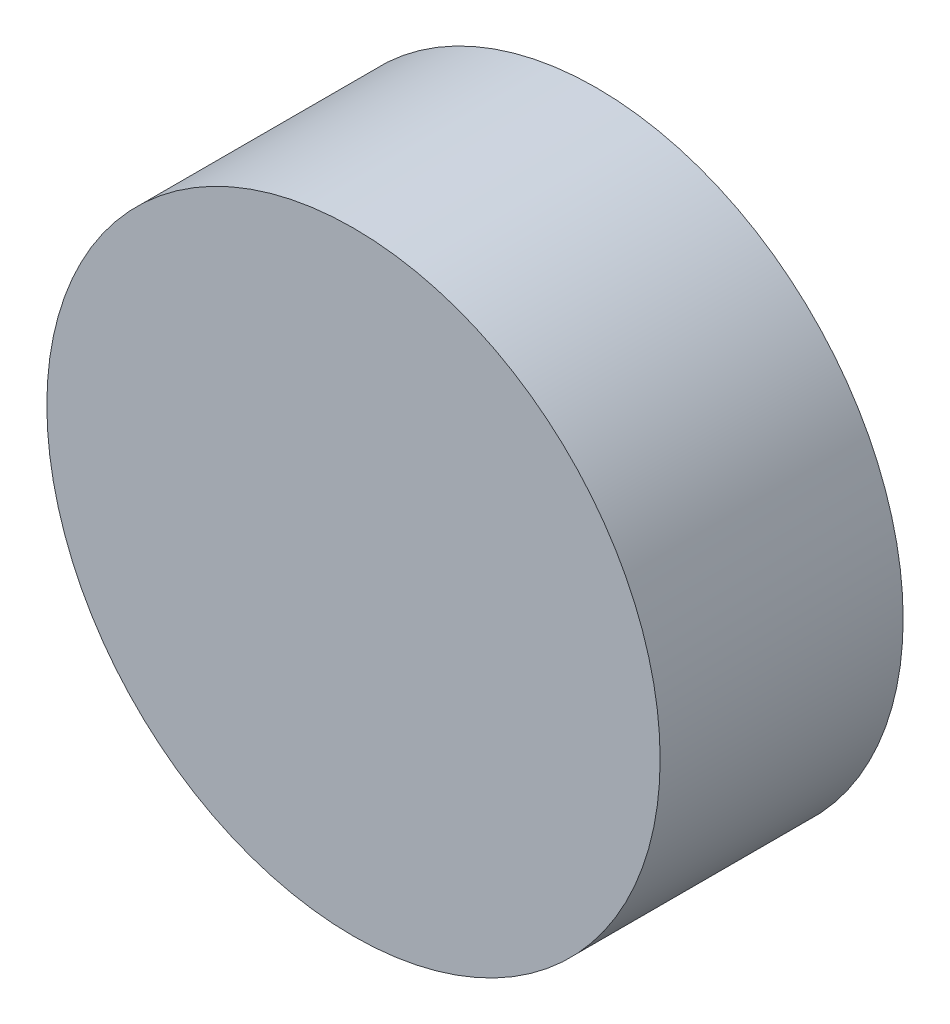
ISO-10303-21;
HEADER;
FILE_DESCRIPTION(('STEP AP214'),'2;1');
FILE_NAME('part.step','',(''),(''),'','','');
FILE_SCHEMA(('AUTOMOTIVE_DESIGN { 1 0 10303 214 1 1 1 1 }'));
ENDSEC;
DATA;
#1=APPLICATION_CONTEXT('core data for automotive mechanical design processes');
#2=APPLICATION_PROTOCOL_DEFINITION('international standard','automotive_design',2000,#1);
#3=PRODUCT_CONTEXT('',#1,'mechanical');
#4=PRODUCT('Part','Part','',(#3));
#5=PRODUCT_RELATED_PRODUCT_CATEGORY('part','',(#4));
#6=PRODUCT_DEFINITION_FORMATION('','',#4);
#7=PRODUCT_DEFINITION_CONTEXT('part definition',#1,'design');
#8=PRODUCT_DEFINITION('design','',#6,#7);
#9=PRODUCT_DEFINITION_SHAPE('','',#8);
#10=(LENGTH_UNIT() NAMED_UNIT(*) SI_UNIT(.MILLI.,.METRE.));
#11=(NAMED_UNIT(*) PLANE_ANGLE_UNIT() SI_UNIT($,.RADIAN.));
#12=(NAMED_UNIT(*) SI_UNIT($,.STERADIAN.) SOLID_ANGLE_UNIT());
#13=UNCERTAINTY_MEASURE_WITH_UNIT(LENGTH_MEASURE(1.E-05),#10,'distance_accuracy_value','');
#14=(GEOMETRIC_REPRESENTATION_CONTEXT(3) GLOBAL_UNCERTAINTY_ASSIGNED_CONTEXT((#13)) GLOBAL_UNIT_ASSIGNED_CONTEXT((#10,
#11,#12)) REPRESENTATION_CONTEXT('',''));
#15=CARTESIAN_POINT('',(0.,0.,0.));
#16=DIRECTION('',(0.,0.,1.));
#17=DIRECTION('',(1.,0.,0.));
#18=AXIS2_PLACEMENT_3D('',#15,#16,#17);
#19=CARTESIAN_POINT('',(0.,0.,42.));
#20=DIRECTION('',(0.,0.,-1.));
#21=DIRECTION('',(-1.,0.,0.));
#22=AXIS2_PLACEMENT_3D('',#19,#20,#21);
#23=CYLINDRICAL_SURFACE('',#22,53.);
#24=CARTESIAN_POINT('',(0.,0.,42.));
#25=DIRECTION('',(0.,0.,1.));
#26=DIRECTION('',(1.,0.,0.));
#27=AXIS2_PLACEMENT_3D('',#24,#25,#26);
#28=CIRCLE('',#27,53.);
#29=CARTESIAN_POINT('',(-53.,0.,42.));
#30=VERTEX_POINT('',#29);
#31=EDGE_CURVE('E10',#30,#30,#28,.T.);
#32=CARTESIAN_POINT('',(0.,0.,0.));
#33=DIRECTION('',(0.,0.,1.));
#34=DIRECTION('',(1.,0.,0.));
#35=AXIS2_PLACEMENT_3D('',#32,#33,#34);
#36=CIRCLE('',#35,53.);
#37=CARTESIAN_POINT('',(-53.,0.,0.));
#38=VERTEX_POINT('',#37);
#39=EDGE_CURVE('E34',#38,#38,#36,.T.);
#40=CARTESIAN_POINT('',(-53.,0.,42.));
#41=CARTESIAN_POINT('',(-53.,0.,41.5625));
#42=CARTESIAN_POINT('',(-53.,0.,41.125));
#43=CARTESIAN_POINT('',(-53.,0.,40.25));
#44=CARTESIAN_POINT('',(-53.,0.,39.8125));
#45=CARTESIAN_POINT('',(-53.,0.,38.9375));
#46=CARTESIAN_POINT('',(-53.,0.,38.5));
#47=CARTESIAN_POINT('',(-53.,0.,37.625));
#48=CARTESIAN_POINT('',(-53.,0.,37.1875));
#49=CARTESIAN_POINT('',(-53.,0.,36.3125));
#50=CARTESIAN_POINT('',(-53.,0.,35.875));
#51=CARTESIAN_POINT('',(-53.,0.,35.));
#52=CARTESIAN_POINT('',(-53.,0.,34.5625));
#53=CARTESIAN_POINT('',(-53.,0.,33.6875));
#54=CARTESIAN_POINT('',(-53.,0.,33.25));
#55=CARTESIAN_POINT('',(-53.,0.,32.375));
#56=CARTESIAN_POINT('',(-53.,0.,31.9375));
#57=CARTESIAN_POINT('',(-53.,0.,31.0625));
#58=CARTESIAN_POINT('',(-53.,0.,30.625));
#59=CARTESIAN_POINT('',(-53.,0.,29.75));
#60=CARTESIAN_POINT('',(-53.,0.,29.3125));
#61=CARTESIAN_POINT('',(-53.,0.,28.4375));
#62=CARTESIAN_POINT('',(-53.,0.,28.));
#63=CARTESIAN_POINT('',(-53.,0.,27.125));
#64=CARTESIAN_POINT('',(-53.,0.,26.6875));
#65=CARTESIAN_POINT('',(-53.,0.,25.8125));
#66=CARTESIAN_POINT('',(-53.,0.,25.375));
#67=CARTESIAN_POINT('',(-53.,0.,24.5));
#68=CARTESIAN_POINT('',(-53.,0.,24.0625));
#69=CARTESIAN_POINT('',(-53.,0.,23.1875));
#70=CARTESIAN_POINT('',(-53.,0.,22.75));
#71=CARTESIAN_POINT('',(-53.,0.,21.875));
#72=CARTESIAN_POINT('',(-53.,0.,21.4375));
#73=CARTESIAN_POINT('',(-53.,0.,20.5625));
#74=CARTESIAN_POINT('',(-53.,0.,20.125));
#75=CARTESIAN_POINT('',(-53.,0.,19.25));
#76=CARTESIAN_POINT('',(-53.,0.,18.8125));
#77=CARTESIAN_POINT('',(-53.,0.,17.9375));
#78=CARTESIAN_POINT('',(-53.,0.,17.5));
#79=CARTESIAN_POINT('',(-53.,0.,16.625));
#80=CARTESIAN_POINT('',(-53.,0.,16.1875));
#81=CARTESIAN_POINT('',(-53.,0.,15.3125));
#82=CARTESIAN_POINT('',(-53.,0.,14.875));
#83=CARTESIAN_POINT('',(-53.,0.,14.));
#84=CARTESIAN_POINT('',(-53.,0.,13.5625));
#85=CARTESIAN_POINT('',(-53.,0.,12.6875));
#86=CARTESIAN_POINT('',(-53.,0.,12.25));
#87=CARTESIAN_POINT('',(-53.,0.,11.375));
#88=CARTESIAN_POINT('',(-53.,0.,10.9375));
#89=CARTESIAN_POINT('',(-53.,0.,10.0625));
#90=CARTESIAN_POINT('',(-53.,0.,9.625));
#91=CARTESIAN_POINT('',(-53.,0.,8.75));
#92=CARTESIAN_POINT('',(-53.,0.,8.3125));
#93=CARTESIAN_POINT('',(-53.,0.,7.4375));
#94=CARTESIAN_POINT('',(-53.,0.,7.));
#95=CARTESIAN_POINT('',(-53.,0.,6.125));
#96=CARTESIAN_POINT('',(-53.,0.,5.6875));
#97=CARTESIAN_POINT('',(-53.,0.,4.8125));
#98=CARTESIAN_POINT('',(-53.,0.,4.375));
#99=CARTESIAN_POINT('',(-53.,0.,3.5));
#100=CARTESIAN_POINT('',(-53.,0.,3.0625));
#101=CARTESIAN_POINT('',(-53.,0.,2.1875));
#102=CARTESIAN_POINT('',(-53.,0.,1.75));
#103=CARTESIAN_POINT('',(-53.,0.,0.875000000000001));
#104=CARTESIAN_POINT('',(-53.,0.,0.4375));
#105=CARTESIAN_POINT('',(-53.,0.,0.));
#106=B_SPLINE_CURVE_WITH_KNOTS('',3,(#40,#41,#42,#43,#44,#45,#46,#47,#48,#49,#50,#51,#52,#53,
#54,#55,#56,#57,#58,#59,#60,#61,#62,#63,#64,#65,#66,#67,#68,#69,#70,#71,#72,#73,#74,#75,#76,#77,
#78,#79,#80,#81,#82,#83,#84,#85,#86,#87,#88,#89,#90,#91,#92,#93,#94,#95,#96,#97,#98,#99,#100,
#101,#102,#103,#104,#105),.UNSPECIFIED.,.F.,.F.,(4,2,2,2,2,2,2,2,2,2,2,2,2,2,2,2,2,2,2,2,2,2,2,
2,2,2,2,2,2,2,2,2,4),(0.,1.3125,2.625,3.9375,5.25,6.56250000000001,7.875,9.1875,10.5,11.8125,
13.125,14.4375,15.75,17.0625,18.375,19.6875,21.,22.3125,23.625,24.9375,26.25,27.5625,28.875,
30.1875,31.5,32.8125,34.125,35.4375,36.75,38.0625,39.375,40.6875,42.),.UNSPECIFIED.);
#107=EDGE_CURVE('BSEAM31',#30,#38,#106,.T.);
#108=ORIENTED_EDGE('',*,*,#31,.F.);
#109=ORIENTED_EDGE('',*,*,#39,.T.);
#110=ORIENTED_EDGE('',*,*,#107,.T.);
#111=ORIENTED_EDGE('',*,*,#107,.F.);
#112=EDGE_LOOP('',(#108,#110,#109,#111));
#113=FACE_BOUND('',#112,.T.);
#114=ADVANCED_FACE('F31',(#113),#23,.T.);
#115=CARTESIAN_POINT('',(0.,0.,42.));
#116=DIRECTION('',(0.,0.,1.));
#117=DIRECTION('',(1.,0.,0.));
#118=AXIS2_PLACEMENT_3D('',#115,#116,#117);
#119=PLANE('',#118);
#120=ORIENTED_EDGE('',*,*,#31,.T.);
#121=EDGE_LOOP('',(#120));
#122=FACE_BOUND('',#121,.T.);
#123=ADVANCED_FACE('F46',(#122),#119,.T.);
#124=CARTESIAN_POINT('',(0.,0.,0.));
#125=DIRECTION('',(0.,0.,1.));
#126=DIRECTION('',(1.,0.,0.));
#127=AXIS2_PLACEMENT_3D('',#124,#125,#126);
#128=PLANE('',#127);
#129=ORIENTED_EDGE('',*,*,#39,.F.);
#130=EDGE_LOOP('',(#129));
#131=FACE_BOUND('',#130,.T.);
#132=ADVANCED_FACE('F44',(#131),#128,.F.);
#133=CLOSED_SHELL('',(#114,#123,#132));
#134=MANIFOLD_SOLID_BREP('B2',#133);
#135=ADVANCED_BREP_SHAPE_REPRESENTATION('',(#18,#134),#14);
#136=SHAPE_DEFINITION_REPRESENTATION(#9,#135);
ENDSEC;
END-ISO-10303-21;
